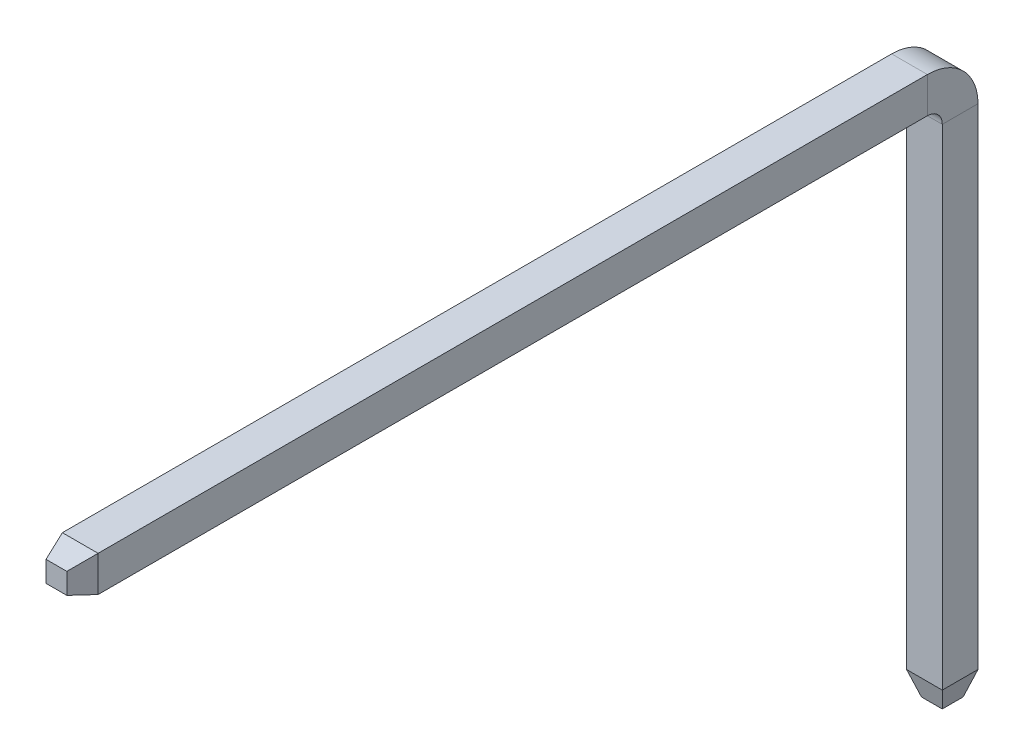
ISO-10303-21;
HEADER;
FILE_DESCRIPTION(('STEP AP214'),'2;1');
FILE_NAME('part.step','',(''),(''),'','','');
FILE_SCHEMA(('AUTOMOTIVE_DESIGN { 1 0 10303 214 1 1 1 1 }'));
ENDSEC;
DATA;
#1=APPLICATION_CONTEXT('core data for automotive mechanical design processes');
#2=APPLICATION_PROTOCOL_DEFINITION('international standard','automotive_design',2000,#1);
#3=PRODUCT_CONTEXT('',#1,'mechanical');
#4=PRODUCT('Part','Part','',(#3));
#5=PRODUCT_RELATED_PRODUCT_CATEGORY('part','',(#4));
#6=PRODUCT_DEFINITION_FORMATION('','',#4);
#7=PRODUCT_DEFINITION_CONTEXT('part definition',#1,'design');
#8=PRODUCT_DEFINITION('design','',#6,#7);
#9=PRODUCT_DEFINITION_SHAPE('','',#8);
#10=(LENGTH_UNIT() NAMED_UNIT(*) SI_UNIT(.MILLI.,.METRE.));
#11=(NAMED_UNIT(*) PLANE_ANGLE_UNIT() SI_UNIT($,.RADIAN.));
#12=(NAMED_UNIT(*) SI_UNIT($,.STERADIAN.) SOLID_ANGLE_UNIT());
#13=UNCERTAINTY_MEASURE_WITH_UNIT(LENGTH_MEASURE(1.E-05),#10,'distance_accuracy_value','');
#14=(GEOMETRIC_REPRESENTATION_CONTEXT(3) GLOBAL_UNCERTAINTY_ASSIGNED_CONTEXT((#13)) GLOBAL_UNIT_ASSIGNED_CONTEXT((#10,
#11,#12)) REPRESENTATION_CONTEXT('',''));
#15=CARTESIAN_POINT('',(0.,0.,0.));
#16=DIRECTION('',(0.,0.,1.));
#17=DIRECTION('',(1.,0.,0.));
#18=AXIS2_PLACEMENT_3D('',#15,#16,#17);
#19=CARTESIAN_POINT('',(0.3,-0.85,-9.18));
#20=DIRECTION('',(1.,0.,0.));
#21=DIRECTION('',(0.,0.,-1.));
#22=AXIS2_PLACEMENT_3D('',#19,#20,#21);
#23=PLANE('',#22);
#24=DIRECTION('',(0.,0.,1.));
#25=VECTOR('',#24,1.);
#26=CARTESIAN_POINT('',(0.3,-0.85,-9.18));
#27=LINE('',#26,#25);
#28=CARTESIAN_POINT('',(0.3,-0.85,-9.18));
#29=VERTEX_POINT('',#28);
#30=CARTESIAN_POINT('',(0.3,-0.85,-8.58));
#31=VERTEX_POINT('',#30);
#32=EDGE_CURVE('E127',#29,#31,#27,.T.);
#33=ORIENTED_EDGE('',*,*,#32,.F.);
#34=CARTESIAN_POINT('',(0.3,-0.85,-8.33));
#35=DIRECTION('',(1.,0.,0.));
#36=DIRECTION('',(0.,0.,-1.));
#37=AXIS2_PLACEMENT_3D('',#34,#35,#36);
#38=CIRCLE('',#37,0.85);
#39=CARTESIAN_POINT('',(0.3,0.,-8.33));
#40=VERTEX_POINT('',#39);
#41=EDGE_CURVE('E131',#40,#29,#38,.F.);
#42=ORIENTED_EDGE('',*,*,#41,.F.);
#43=DIRECTION('',(0.,1.,0.));
#44=VECTOR('',#43,1.);
#45=CARTESIAN_POINT('',(0.3,-0.6,-8.33));
#46=LINE('',#45,#44);
#47=CARTESIAN_POINT('',(0.3,-0.6,-8.33));
#48=VERTEX_POINT('',#47);
#49=EDGE_CURVE('E139',#48,#40,#46,.T.);
#50=ORIENTED_EDGE('',*,*,#49,.F.);
#51=CARTESIAN_POINT('',(0.3,-0.85,-8.33));
#52=DIRECTION('',(1.,0.,0.));
#53=DIRECTION('',(0.,0.,-1.));
#54=AXIS2_PLACEMENT_3D('',#51,#52,#53);
#55=CIRCLE('',#54,0.25);
#56=EDGE_CURVE('E133',#48,#31,#55,.F.);
#57=ORIENTED_EDGE('',*,*,#56,.T.);
#58=EDGE_LOOP('',(#33,#42,#50,#57));
#59=FACE_BOUND('',#58,.T.);
#60=ADVANCED_FACE('F38',(#59),#23,.T.);
#61=CARTESIAN_POINT('',(0.3,-0.6,-8.33));
#62=DIRECTION('',(1.,0.,0.));
#63=DIRECTION('',(0.,0.,-1.));
#64=AXIS2_PLACEMENT_3D('',#61,#62,#63);
#65=PLANE('',#64);
#66=DIRECTION('',(0.,-1.,0.));
#67=VECTOR('',#66,1.);
#68=CARTESIAN_POINT('',(0.3,0.,-8.58));
#69=LINE('',#68,#67);
#70=CARTESIAN_POINT('',(0.3,-9.08,-8.58));
#71=VERTEX_POINT('',#70);
#72=EDGE_CURVE('E160',#31,#71,#69,.T.);
#73=ORIENTED_EDGE('',*,*,#72,.T.);
#74=DIRECTION('',(0.,0.,-1.));
#75=VECTOR('',#74,1.);
#76=CARTESIAN_POINT('',(0.3,-9.08,-8.33));
#77=LINE('',#76,#75);
#78=CARTESIAN_POINT('',(0.3,-9.08,-9.18));
#79=VERTEX_POINT('',#78);
#80=EDGE_CURVE('E159',#71,#79,#77,.T.);
#81=ORIENTED_EDGE('',*,*,#80,.T.);
#82=DIRECTION('',(0.,-1.,0.));
#83=VECTOR('',#82,1.);
#84=CARTESIAN_POINT('',(0.3,0.,-9.18));
#85=LINE('',#84,#83);
#86=EDGE_CURVE('E147',#29,#79,#85,.T.);
#87=ORIENTED_EDGE('',*,*,#86,.F.);
#88=ORIENTED_EDGE('',*,*,#32,.T.);
#89=EDGE_LOOP('',(#73,#81,#87,#88));
#90=FACE_BOUND('',#89,.T.);
#91=ADVANCED_FACE('F157',(#90),#65,.T.);
#92=CARTESIAN_POINT('',(-0.3,0.,-8.33));
#93=DIRECTION('',(-1.,0.,0.));
#94=DIRECTION('',(0.,0.,1.));
#95=AXIS2_PLACEMENT_3D('',#92,#93,#94);
#96=PLANE('',#95);
#97=DIRECTION('',(0.,-1.,0.));
#98=VECTOR('',#97,1.);
#99=CARTESIAN_POINT('',(-0.3,0.,-8.33));
#100=LINE('',#99,#98);
#101=CARTESIAN_POINT('',(-0.3,0.,-8.33));
#102=VERTEX_POINT('',#101);
#103=CARTESIAN_POINT('',(-0.3,-0.6,-8.33));
#104=VERTEX_POINT('',#103);
#105=EDGE_CURVE('E195',#102,#104,#100,.T.);
#106=ORIENTED_EDGE('',*,*,#105,.F.);
#107=CARTESIAN_POINT('',(-0.3,-0.85,-8.33));
#108=DIRECTION('',(1.,0.,0.));
#109=DIRECTION('',(0.,0.,-1.));
#110=AXIS2_PLACEMENT_3D('',#107,#108,#109);
#111=CIRCLE('',#110,0.85);
#112=CARTESIAN_POINT('',(-0.3,-0.85,-9.18));
#113=VERTEX_POINT('',#112);
#114=EDGE_CURVE('E179',#102,#113,#111,.F.);
#115=ORIENTED_EDGE('',*,*,#114,.T.);
#116=DIRECTION('',(0.,0.,-1.));
#117=VECTOR('',#116,1.);
#118=CARTESIAN_POINT('',(-0.3,-0.85,-8.58));
#119=LINE('',#118,#117);
#120=CARTESIAN_POINT('',(-0.3,-0.85,-8.58));
#121=VERTEX_POINT('',#120);
#122=EDGE_CURVE('E154',#121,#113,#119,.T.);
#123=ORIENTED_EDGE('',*,*,#122,.F.);
#124=CARTESIAN_POINT('',(-0.3,-0.85,-8.33));
#125=DIRECTION('',(1.,0.,0.));
#126=DIRECTION('',(0.,0.,-1.));
#127=AXIS2_PLACEMENT_3D('',#124,#125,#126);
#128=CIRCLE('',#127,0.25);
#129=EDGE_CURVE('E185',#104,#121,#128,.F.);
#130=ORIENTED_EDGE('',*,*,#129,.F.);
#131=EDGE_LOOP('',(#106,#115,#123,#130));
#132=FACE_BOUND('',#131,.T.);
#133=ADVANCED_FACE('F271',(#132),#96,.T.);
#134=CARTESIAN_POINT('',(-0.3,-0.85,-8.58));
#135=DIRECTION('',(-1.,0.,0.));
#136=DIRECTION('',(0.,0.,1.));
#137=AXIS2_PLACEMENT_3D('',#134,#135,#136);
#138=PLANE('',#137);
#139=DIRECTION('',(0.,0.,-1.));
#140=VECTOR('',#139,1.);
#141=CARTESIAN_POINT('',(-0.3,-0.6,0.));
#142=LINE('',#141,#140);
#143=CARTESIAN_POINT('',(-0.3,-0.6,5.6));
#144=VERTEX_POINT('',#143);
#145=EDGE_CURVE('E183',#144,#104,#142,.T.);
#146=ORIENTED_EDGE('',*,*,#145,.F.);
#147=DIRECTION('',(0.,1.,0.));
#148=VECTOR('',#147,1.);
#149=CARTESIAN_POINT('',(-0.3,-0.85,5.6));
#150=LINE('',#149,#148);
#151=CARTESIAN_POINT('',(-0.3,0.,5.6));
#152=VERTEX_POINT('',#151);
#153=EDGE_CURVE('E216',#144,#152,#150,.T.);
#154=ORIENTED_EDGE('',*,*,#153,.T.);
#155=DIRECTION('',(0.,0.,-1.));
#156=VECTOR('',#155,1.);
#157=CARTESIAN_POINT('',(-0.3,0.,6.));
#158=LINE('',#157,#156);
#159=EDGE_CURVE('E181',#152,#102,#158,.T.);
#160=ORIENTED_EDGE('',*,*,#159,.T.);
#161=ORIENTED_EDGE('',*,*,#105,.T.);
#162=EDGE_LOOP('',(#146,#154,#160,#161));
#163=FACE_BOUND('',#162,.T.);
#164=ADVANCED_FACE('F267',(#163),#138,.T.);
#165=CARTESIAN_POINT('',(0.3,0.,-8.58));
#166=DIRECTION('',(0.,0.,-1.));
#167=DIRECTION('',(0.,1.,0.));
#168=AXIS2_PLACEMENT_3D('',#165,#166,#167);
#169=PLANE('',#168);
#170=DIRECTION('',(0.,-1.,0.));
#171=VECTOR('',#170,1.);
#172=CARTESIAN_POINT('',(-0.3,0.,-8.58));
#173=LINE('',#172,#171);
#174=CARTESIAN_POINT('',(-0.3,-9.08,-8.58));
#175=VERTEX_POINT('',#174);
#176=EDGE_CURVE('E174',#121,#175,#173,.T.);
#177=ORIENTED_EDGE('',*,*,#176,.T.);
#178=DIRECTION('',(1.,0.,0.));
#179=VECTOR('',#178,1.);
#180=CARTESIAN_POINT('',(0.3,-9.08,-8.58));
#181=LINE('',#180,#179);
#182=EDGE_CURVE('E213',#175,#71,#181,.T.);
#183=ORIENTED_EDGE('',*,*,#182,.T.);
#184=ORIENTED_EDGE('',*,*,#72,.F.);
#185=DIRECTION('',(-1.,0.,0.));
#186=VECTOR('',#185,1.);
#187=CARTESIAN_POINT('',(0.3,-0.85,-8.58));
#188=LINE('',#187,#186);
#189=EDGE_CURVE('E173',#31,#121,#188,.T.);
#190=ORIENTED_EDGE('',*,*,#189,.T.);
#191=EDGE_LOOP('',(#177,#183,#184,#190));
#192=FACE_BOUND('',#191,.T.);
#193=ADVANCED_FACE('F397',(#192),#169,.F.);
#194=CARTESIAN_POINT('',(0.3,-9.48,-9.18));
#195=DIRECTION('',(0.,-1.,0.));
#196=DIRECTION('',(0.,0.,-1.));
#197=AXIS2_PLACEMENT_3D('',#194,#195,#196);
#198=PLANE('',#197);
#199=DIRECTION('',(-1.,0.,0.));
#200=VECTOR('',#199,1.);
#201=CARTESIAN_POINT('',(-0.3,-9.48,-8.705));
#202=LINE('',#201,#200);
#203=CARTESIAN_POINT('',(0.175000000000001,-9.48,-8.705));
#204=VERTEX_POINT('',#203);
#205=CARTESIAN_POINT('',(-0.175000000000001,-9.48,-8.705));
#206=VERTEX_POINT('',#205);
#207=EDGE_CURVE('E204',#204,#206,#202,.T.);
#208=ORIENTED_EDGE('',*,*,#207,.T.);
#209=DIRECTION('',(0.,0.,-1.));
#210=VECTOR('',#209,1.);
#211=CARTESIAN_POINT('',(-0.175000000000001,-9.48,-9.18));
#212=LINE('',#211,#210);
#213=CARTESIAN_POINT('',(-0.175000000000001,-9.48,-9.055));
#214=VERTEX_POINT('',#213);
#215=EDGE_CURVE('E208',#206,#214,#212,.T.);
#216=ORIENTED_EDGE('',*,*,#215,.T.);
#217=DIRECTION('',(1.,0.,0.));
#218=VECTOR('',#217,1.);
#219=CARTESIAN_POINT('',(0.3,-9.48,-9.055));
#220=LINE('',#219,#218);
#221=CARTESIAN_POINT('',(0.175000000000001,-9.48,-9.055));
#222=VERTEX_POINT('',#221);
#223=EDGE_CURVE('E206',#214,#222,#220,.T.);
#224=ORIENTED_EDGE('',*,*,#223,.T.);
#225=DIRECTION('',(0.,0.,1.));
#226=VECTOR('',#225,1.);
#227=CARTESIAN_POINT('',(0.175000000000001,-9.48,-9.18));
#228=LINE('',#227,#226);
#229=EDGE_CURVE('E202',#222,#204,#228,.T.);
#230=ORIENTED_EDGE('',*,*,#229,.T.);
#231=EDGE_LOOP('',(#208,#216,#224,#230));
#232=FACE_BOUND('',#231,.T.);
#233=ADVANCED_FACE('F386',(#232),#198,.T.);
#234=CARTESIAN_POINT('',(0.3,0.,-9.18));
#235=DIRECTION('',(0.,0.,-1.));
#236=DIRECTION('',(0.,1.,0.));
#237=AXIS2_PLACEMENT_3D('',#234,#235,#236);
#238=PLANE('',#237);
#239=ORIENTED_EDGE('',*,*,#86,.T.);
#240=DIRECTION('',(-1.,0.,0.));
#241=VECTOR('',#240,1.);
#242=CARTESIAN_POINT('',(0.3,-9.08,-9.18));
#243=LINE('',#242,#241);
#244=CARTESIAN_POINT('',(-0.3,-9.08,-9.18));
#245=VERTEX_POINT('',#244);
#246=EDGE_CURVE('E211',#79,#245,#243,.T.);
#247=ORIENTED_EDGE('',*,*,#246,.T.);
#248=DIRECTION('',(0.,-1.,0.));
#249=VECTOR('',#248,1.);
#250=CARTESIAN_POINT('',(-0.3,0.,-9.18));
#251=LINE('',#250,#249);
#252=EDGE_CURVE('E150',#113,#245,#251,.T.);
#253=ORIENTED_EDGE('',*,*,#252,.F.);
#254=DIRECTION('',(-1.,0.,0.));
#255=VECTOR('',#254,1.);
#256=CARTESIAN_POINT('',(0.3,-0.85,-9.18));
#257=LINE('',#256,#255);
#258=EDGE_CURVE('E145',#29,#113,#257,.T.);
#259=ORIENTED_EDGE('',*,*,#258,.F.);
#260=EDGE_LOOP('',(#239,#247,#253,#259));
#261=FACE_BOUND('',#260,.T.);
#262=ADVANCED_FACE('F146',(#261),#238,.T.);
#263=CARTESIAN_POINT('',(0.3,-0.85,-8.33));
#264=DIRECTION('',(-1.,0.,0.));
#265=DIRECTION('',(0.,0.,1.));
#266=AXIS2_PLACEMENT_3D('',#263,#264,#265);
#267=CYLINDRICAL_SURFACE('',#266,0.85);
#268=ORIENTED_EDGE('',*,*,#114,.F.);
#269=DIRECTION('',(-1.,0.,0.));
#270=VECTOR('',#269,1.);
#271=CARTESIAN_POINT('',(0.3,0.,-8.33));
#272=LINE('',#271,#270);
#273=EDGE_CURVE('E155',#40,#102,#272,.T.);
#274=ORIENTED_EDGE('',*,*,#273,.F.);
#275=ORIENTED_EDGE('',*,*,#41,.T.);
#276=ORIENTED_EDGE('',*,*,#258,.T.);
#277=EDGE_LOOP('',(#268,#274,#275,#276));
#278=FACE_BOUND('',#277,.T.);
#279=ADVANCED_FACE('F163',(#278),#267,.T.);
#280=CARTESIAN_POINT('',(0.3,0.,6.));
#281=DIRECTION('',(0.,1.,0.));
#282=DIRECTION('',(0.,0.,1.));
#283=AXIS2_PLACEMENT_3D('',#280,#281,#282);
#284=PLANE('',#283);
#285=ORIENTED_EDGE('',*,*,#159,.F.);
#286=DIRECTION('',(1.,0.,0.));
#287=VECTOR('',#286,1.);
#288=CARTESIAN_POINT('',(0.3,0.,5.6));
#289=LINE('',#288,#287);
#290=CARTESIAN_POINT('',(0.3,0.,5.6));
#291=VERTEX_POINT('',#290);
#292=EDGE_CURVE('E11',#152,#291,#289,.T.);
#293=ORIENTED_EDGE('',*,*,#292,.T.);
#294=DIRECTION('',(0.,0.,-1.));
#295=VECTOR('',#294,1.);
#296=CARTESIAN_POINT('',(0.3,0.,0.));
#297=LINE('',#296,#295);
#298=EDGE_CURVE('E165',#291,#40,#297,.T.);
#299=ORIENTED_EDGE('',*,*,#298,.T.);
#300=ORIENTED_EDGE('',*,*,#273,.T.);
#301=EDGE_LOOP('',(#285,#293,#299,#300));
#302=FACE_BOUND('',#301,.T.);
#303=ADVANCED_FACE('F269',(#302),#284,.T.);
#304=CARTESIAN_POINT('',(0.3,-0.6,6.));
#305=DIRECTION('',(0.,0.,1.));
#306=DIRECTION('',(1.,0.,0.));
#307=AXIS2_PLACEMENT_3D('',#304,#305,#306);
#308=PLANE('',#307);
#309=DIRECTION('',(-1.,0.,0.));
#310=VECTOR('',#309,1.);
#311=CARTESIAN_POINT('',(0.3,-0.124999999999999,6.));
#312=LINE('',#311,#310);
#313=CARTESIAN_POINT('',(0.175000000000001,-0.124999999999999,6.));
#314=VERTEX_POINT('',#313);
#315=CARTESIAN_POINT('',(-0.175000000000001,-0.124999999999999,6.));
#316=VERTEX_POINT('',#315);
#317=EDGE_CURVE('E219',#314,#316,#312,.T.);
#318=ORIENTED_EDGE('',*,*,#317,.T.);
#319=DIRECTION('',(0.,-1.,0.));
#320=VECTOR('',#319,1.);
#321=CARTESIAN_POINT('',(-0.175000000000001,-0.6,6.));
#322=LINE('',#321,#320);
#323=CARTESIAN_POINT('',(-0.175000000000001,-0.475000000000001,6.));
#324=VERTEX_POINT('',#323);
#325=EDGE_CURVE('E225',#316,#324,#322,.T.);
#326=ORIENTED_EDGE('',*,*,#325,.T.);
#327=DIRECTION('',(1.,0.,0.));
#328=VECTOR('',#327,1.);
#329=CARTESIAN_POINT('',(0.3,-0.475000000000001,6.));
#330=LINE('',#329,#328);
#331=CARTESIAN_POINT('',(0.175000000000001,-0.475000000000001,6.));
#332=VERTEX_POINT('',#331);
#333=EDGE_CURVE('E223',#324,#332,#330,.T.);
#334=ORIENTED_EDGE('',*,*,#333,.T.);
#335=DIRECTION('',(0.,1.,0.));
#336=VECTOR('',#335,1.);
#337=CARTESIAN_POINT('',(0.175000000000001,-0.6,6.));
#338=LINE('',#337,#336);
#339=EDGE_CURVE('E221',#332,#314,#338,.T.);
#340=ORIENTED_EDGE('',*,*,#339,.T.);
#341=EDGE_LOOP('',(#318,#326,#334,#340));
#342=FACE_BOUND('',#341,.T.);
#343=ADVANCED_FACE('F258',(#342),#308,.T.);
#344=CARTESIAN_POINT('',(0.3,-0.6,0.));
#345=DIRECTION('',(0.,1.,0.));
#346=DIRECTION('',(0.,0.,1.));
#347=AXIS2_PLACEMENT_3D('',#344,#345,#346);
#348=PLANE('',#347);
#349=DIRECTION('',(0.,0.,-1.));
#350=VECTOR('',#349,1.);
#351=CARTESIAN_POINT('',(0.3,-0.6,6.));
#352=LINE('',#351,#350);
#353=CARTESIAN_POINT('',(0.3,-0.6,5.6));
#354=VERTEX_POINT('',#353);
#355=EDGE_CURVE('E167',#354,#48,#352,.T.);
#356=ORIENTED_EDGE('',*,*,#355,.F.);
#357=DIRECTION('',(-1.,0.,0.));
#358=VECTOR('',#357,1.);
#359=CARTESIAN_POINT('',(-0.3,-0.6,5.6));
#360=LINE('',#359,#358);
#361=EDGE_CURVE('E228',#354,#144,#360,.T.);
#362=ORIENTED_EDGE('',*,*,#361,.T.);
#363=ORIENTED_EDGE('',*,*,#145,.T.);
#364=DIRECTION('',(-1.,0.,0.));
#365=VECTOR('',#364,1.);
#366=CARTESIAN_POINT('',(0.3,-0.6,-8.33));
#367=LINE('',#366,#365);
#368=EDGE_CURVE('E190',#48,#104,#367,.T.);
#369=ORIENTED_EDGE('',*,*,#368,.F.);
#370=EDGE_LOOP('',(#356,#362,#363,#369));
#371=FACE_BOUND('',#370,.T.);
#372=ADVANCED_FACE('F277',(#371),#348,.F.);
#373=CARTESIAN_POINT('',(0.3,-0.85,-8.33));
#374=DIRECTION('',(-1.,0.,0.));
#375=DIRECTION('',(0.,0.,1.));
#376=AXIS2_PLACEMENT_3D('',#373,#374,#375);
#377=CYLINDRICAL_SURFACE('',#376,0.25);
#378=ORIENTED_EDGE('',*,*,#129,.T.);
#379=ORIENTED_EDGE('',*,*,#189,.F.);
#380=ORIENTED_EDGE('',*,*,#56,.F.);
#381=ORIENTED_EDGE('',*,*,#368,.T.);
#382=EDGE_LOOP('',(#378,#379,#380,#381));
#383=FACE_BOUND('',#382,.T.);
#384=ADVANCED_FACE('F275',(#383),#377,.F.);
#385=CARTESIAN_POINT('',(0.3,-0.85,-8.33));
#386=DIRECTION('',(1.,0.,0.));
#387=DIRECTION('',(0.,0.,-1.));
#388=AXIS2_PLACEMENT_3D('',#385,#386,#387);
#389=PLANE('',#388);
#390=ORIENTED_EDGE('',*,*,#298,.F.);
#391=DIRECTION('',(0.,-1.,0.));
#392=VECTOR('',#391,1.);
#393=CARTESIAN_POINT('',(0.3,-0.85,5.6));
#394=LINE('',#393,#392);
#395=EDGE_CURVE('E47',#291,#354,#394,.T.);
#396=ORIENTED_EDGE('',*,*,#395,.T.);
#397=ORIENTED_EDGE('',*,*,#355,.T.);
#398=ORIENTED_EDGE('',*,*,#49,.T.);
#399=EDGE_LOOP('',(#390,#396,#397,#398));
#400=FACE_BOUND('',#399,.T.);
#401=ADVANCED_FACE('F278',(#400),#389,.T.);
#402=CARTESIAN_POINT('',(-0.3,-0.85,-8.33));
#403=DIRECTION('',(1.,0.,0.));
#404=DIRECTION('',(0.,0.,-1.));
#405=AXIS2_PLACEMENT_3D('',#402,#403,#404);
#406=PLANE('',#405);
#407=ORIENTED_EDGE('',*,*,#252,.T.);
#408=DIRECTION('',(0.,0.,1.));
#409=VECTOR('',#408,1.);
#410=CARTESIAN_POINT('',(-0.3,-9.08,-8.58));
#411=LINE('',#410,#409);
#412=EDGE_CURVE('E138',#245,#175,#411,.T.);
#413=ORIENTED_EDGE('',*,*,#412,.T.);
#414=ORIENTED_EDGE('',*,*,#176,.F.);
#415=ORIENTED_EDGE('',*,*,#122,.T.);
#416=EDGE_LOOP('',(#407,#413,#414,#415));
#417=FACE_BOUND('',#416,.T.);
#418=ADVANCED_FACE('F280',(#417),#406,.F.);
#419=CARTESIAN_POINT('',(0.175000000000001,-9.48,-9.18));
#420=DIRECTION('',(-0.95447997803503,0.298274993135944,0.));
#421=DIRECTION('',(0.,0.,1.));
#422=AXIS2_PLACEMENT_3D('',#419,#420,#421);
#423=PLANE('',#422);
#424=DIRECTION('',(0.285830975237513,0.914659120760049,0.285830975237511));
#425=VECTOR('',#424,1.);
#426=CARTESIAN_POINT('',(0.136192810457518,-9.60418300653595,-8.74380718954248));
#427=LINE('',#426,#425);
#428=EDGE_CURVE('E235',#204,#71,#427,.T.);
#429=ORIENTED_EDGE('',*,*,#428,.F.);
#430=ORIENTED_EDGE('',*,*,#229,.F.);
#431=DIRECTION('',(0.285830975237513,0.914659120760049,-0.285830975237511));
#432=VECTOR('',#431,1.);
#433=CARTESIAN_POINT('',(0.185212418300654,-9.44732026143791,-9.06521241830066));
#434=LINE('',#433,#432);
#435=EDGE_CURVE('E177',#79,#222,#434,.F.);
#436=ORIENTED_EDGE('',*,*,#435,.F.);
#437=ORIENTED_EDGE('',*,*,#80,.F.);
#438=EDGE_LOOP('',(#429,#430,#436,#437));
#439=FACE_BOUND('',#438,.T.);
#440=ADVANCED_FACE('F286',(#439),#423,.F.);
#441=CARTESIAN_POINT('',(0.3,-9.08,-9.18));
#442=DIRECTION('',(0.,0.298274993135943,0.954479978035031));
#443=DIRECTION('',(-1.,0.,0.));
#444=AXIS2_PLACEMENT_3D('',#441,#442,#443);
#445=PLANE('',#444);
#446=ORIENTED_EDGE('',*,*,#435,.T.);
#447=ORIENTED_EDGE('',*,*,#223,.F.);
#448=DIRECTION('',(0.285830975237513,-0.914659120760049,0.285830975237511));
#449=VECTOR('',#448,1.);
#450=CARTESIAN_POINT('',(-0.250980392156863,-9.23686274509804,-9.13098039215686));
#451=LINE('',#450,#449);
#452=EDGE_CURVE('E233',#245,#214,#451,.T.);
#453=ORIENTED_EDGE('',*,*,#452,.F.);
#454=ORIENTED_EDGE('',*,*,#246,.F.);
#455=EDGE_LOOP('',(#446,#447,#453,#454));
#456=FACE_BOUND('',#455,.T.);
#457=ADVANCED_FACE('F305',(#456),#445,.F.);
#458=CARTESIAN_POINT('',(0.3,-9.48,-8.705));
#459=DIRECTION('',(0.,-0.298274993135943,0.954479978035031));
#460=DIRECTION('',(1.,0.,0.));
#461=AXIS2_PLACEMENT_3D('',#458,#459,#460);
#462=PLANE('',#461);
#463=ORIENTED_EDGE('',*,*,#428,.T.);
#464=ORIENTED_EDGE('',*,*,#182,.F.);
#465=DIRECTION('',(0.285830975237513,-0.914659120760049,-0.285830975237511));
#466=VECTOR('',#465,1.);
#467=CARTESIAN_POINT('',(-0.136192810457518,-9.60418300653595,-8.74380718954248));
#468=LINE('',#467,#466);
#469=EDGE_CURVE('E231',#206,#175,#468,.F.);
#470=ORIENTED_EDGE('',*,*,#469,.F.);
#471=ORIENTED_EDGE('',*,*,#207,.F.);
#472=EDGE_LOOP('',(#463,#464,#470,#471));
#473=FACE_BOUND('',#472,.T.);
#474=ADVANCED_FACE('F301',(#473),#462,.T.);
#475=CARTESIAN_POINT('',(-0.3,-9.08,-8.33));
#476=DIRECTION('',(-0.95447997803503,-0.298274993135944,0.));
#477=DIRECTION('',(0.,0.,-1.));
#478=AXIS2_PLACEMENT_3D('',#475,#476,#477);
#479=PLANE('',#478);
#480=ORIENTED_EDGE('',*,*,#452,.T.);
#481=ORIENTED_EDGE('',*,*,#215,.F.);
#482=ORIENTED_EDGE('',*,*,#469,.T.);
#483=ORIENTED_EDGE('',*,*,#412,.F.);
#484=EDGE_LOOP('',(#480,#481,#482,#483));
#485=FACE_BOUND('',#484,.T.);
#486=ADVANCED_FACE('F298',(#485),#479,.T.);
#487=CARTESIAN_POINT('',(0.175000000000001,-0.6,6.));
#488=DIRECTION('',(-0.95447997803503,0.,-0.298274993135944));
#489=DIRECTION('',(0.,1.,0.));
#490=AXIS2_PLACEMENT_3D('',#487,#488,#489);
#491=PLANE('',#490);
#492=DIRECTION('',(0.285830975237513,0.285830975237513,-0.914659120760048));
#493=VECTOR('',#492,1.);
#494=CARTESIAN_POINT('',(0.185212418300654,-0.114787581699346,5.96732026143791));
#495=LINE('',#494,#493);
#496=EDGE_CURVE('E243',#314,#291,#495,.T.);
#497=ORIENTED_EDGE('',*,*,#496,.F.);
#498=ORIENTED_EDGE('',*,*,#339,.F.);
#499=DIRECTION('',(-0.285830975237513,0.285830975237513,0.914659120760048));
#500=VECTOR('',#499,1.);
#501=CARTESIAN_POINT('',(0.185212418300654,-0.485212418300654,5.96732026143791));
#502=LINE('',#501,#500);
#503=EDGE_CURVE('E42',#354,#332,#502,.T.);
#504=ORIENTED_EDGE('',*,*,#503,.F.);
#505=ORIENTED_EDGE('',*,*,#395,.F.);
#506=EDGE_LOOP('',(#497,#498,#504,#505));
#507=FACE_BOUND('',#506,.T.);
#508=ADVANCED_FACE('F40',(#507),#491,.F.);
#509=CARTESIAN_POINT('',(0.3,-0.6,5.6));
#510=DIRECTION('',(0.,-0.95447997803503,0.298274993135944));
#511=DIRECTION('',(1.,0.,0.));
#512=AXIS2_PLACEMENT_3D('',#509,#510,#511);
#513=PLANE('',#512);
#514=ORIENTED_EDGE('',*,*,#503,.T.);
#515=ORIENTED_EDGE('',*,*,#333,.F.);
#516=DIRECTION('',(0.285830975237513,0.285830975237513,0.914659120760048));
#517=VECTOR('',#516,1.);
#518=CARTESIAN_POINT('',(-0.250980392156863,-0.550980392156863,5.75686274509804));
#519=LINE('',#518,#517);
#520=EDGE_CURVE('E242',#144,#324,#519,.T.);
#521=ORIENTED_EDGE('',*,*,#520,.F.);
#522=ORIENTED_EDGE('',*,*,#361,.F.);
#523=EDGE_LOOP('',(#514,#515,#521,#522));
#524=FACE_BOUND('',#523,.T.);
#525=ADVANCED_FACE('F253',(#524),#513,.T.);
#526=CARTESIAN_POINT('',(0.3,-0.124999999999999,6.));
#527=DIRECTION('',(0.,-0.95447997803503,-0.298274993135944));
#528=DIRECTION('',(-1.,0.,0.));
#529=AXIS2_PLACEMENT_3D('',#526,#527,#528);
#530=PLANE('',#529);
#531=ORIENTED_EDGE('',*,*,#496,.T.);
#532=ORIENTED_EDGE('',*,*,#292,.F.);
#533=DIRECTION('',(0.285830975237513,-0.285830975237513,0.914659120760048));
#534=VECTOR('',#533,1.);
#535=CARTESIAN_POINT('',(-0.136192810457518,-0.163807189542482,6.12418300653595));
#536=LINE('',#535,#534);
#537=EDGE_CURVE('E240',#316,#152,#536,.F.);
#538=ORIENTED_EDGE('',*,*,#537,.F.);
#539=ORIENTED_EDGE('',*,*,#317,.F.);
#540=EDGE_LOOP('',(#531,#532,#538,#539));
#541=FACE_BOUND('',#540,.T.);
#542=ADVANCED_FACE('F264',(#541),#530,.F.);
#543=CARTESIAN_POINT('',(-0.3,-0.85,5.6));
#544=DIRECTION('',(0.95447997803503,0.,-0.298274993135944));
#545=DIRECTION('',(0.,1.,0.));
#546=AXIS2_PLACEMENT_3D('',#543,#544,#545);
#547=PLANE('',#546);
#548=ORIENTED_EDGE('',*,*,#520,.T.);
#549=ORIENTED_EDGE('',*,*,#325,.F.);
#550=ORIENTED_EDGE('',*,*,#537,.T.);
#551=ORIENTED_EDGE('',*,*,#153,.F.);
#552=EDGE_LOOP('',(#548,#549,#550,#551));
#553=FACE_BOUND('',#552,.T.);
#554=ADVANCED_FACE('F262',(#553),#547,.F.);
#555=CLOSED_SHELL('',(#60,#91,#133,#164,#193,#233,#262,#279,#303,#343,#372,#384,#401,#418,#440,
#457,#474,#486,#508,#525,#542,#554));
#556=MANIFOLD_SOLID_BREP('B2',#555);
#557=ADVANCED_BREP_SHAPE_REPRESENTATION('',(#18,#556),#14);
#558=SHAPE_DEFINITION_REPRESENTATION(#9,#557);
ENDSEC;
END-ISO-10303-21;
